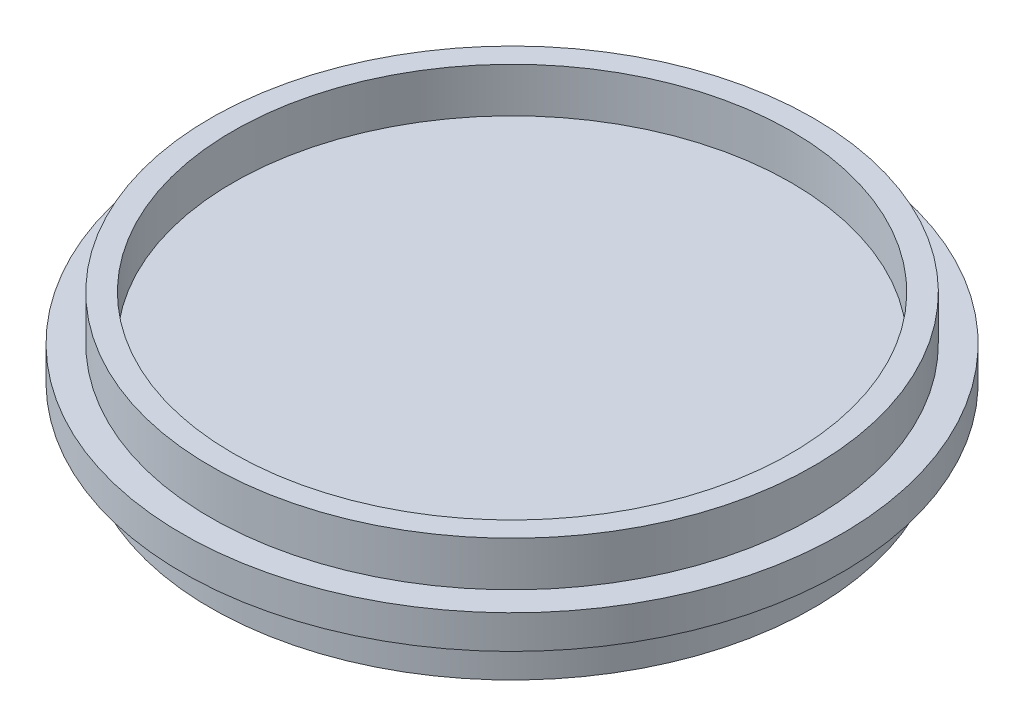
ISO-10303-21;
HEADER;
FILE_DESCRIPTION(('STEP AP214'),'2;1');
FILE_NAME('part.step','',(''),(''),'','','');
FILE_SCHEMA(('AUTOMOTIVE_DESIGN { 1 0 10303 214 1 1 1 1 }'));
ENDSEC;
DATA;
#1=APPLICATION_CONTEXT('core data for automotive mechanical design processes');
#2=APPLICATION_PROTOCOL_DEFINITION('international standard','automotive_design',2000,#1);
#3=PRODUCT_CONTEXT('',#1,'mechanical');
#4=PRODUCT('Part','Part','',(#3));
#5=PRODUCT_RELATED_PRODUCT_CATEGORY('part','',(#4));
#6=PRODUCT_DEFINITION_FORMATION('','',#4);
#7=PRODUCT_DEFINITION_CONTEXT('part definition',#1,'design');
#8=PRODUCT_DEFINITION('design','',#6,#7);
#9=PRODUCT_DEFINITION_SHAPE('','',#8);
#10=(LENGTH_UNIT() NAMED_UNIT(*) SI_UNIT(.MILLI.,.METRE.));
#11=(NAMED_UNIT(*) PLANE_ANGLE_UNIT() SI_UNIT($,.RADIAN.));
#12=(NAMED_UNIT(*) SI_UNIT($,.STERADIAN.) SOLID_ANGLE_UNIT());
#13=UNCERTAINTY_MEASURE_WITH_UNIT(LENGTH_MEASURE(1.E-05),#10,'distance_accuracy_value','');
#14=(GEOMETRIC_REPRESENTATION_CONTEXT(3) GLOBAL_UNCERTAINTY_ASSIGNED_CONTEXT((#13)) GLOBAL_UNIT_ASSIGNED_CONTEXT((#10,
#11,#12)) REPRESENTATION_CONTEXT('',''));
#15=CARTESIAN_POINT('',(0.,0.,0.));
#16=DIRECTION('',(0.,0.,1.));
#17=DIRECTION('',(1.,0.,0.));
#18=AXIS2_PLACEMENT_3D('',#15,#16,#17);
#19=CARTESIAN_POINT('',(63.8175,274.622160693961,-63.8175));
#20=DIRECTION('',(0.,-1.,0.));
#21=DIRECTION('',(0.,0.,-1.));
#22=AXIS2_PLACEMENT_3D('',#19,#20,#21);
#23=CYLINDRICAL_SURFACE('',#22,93.726);
#24=CARTESIAN_POINT('',(63.8175,9.52500000000001,-63.8175));
#25=DIRECTION('',(0.,-1.,0.));
#26=DIRECTION('',(0.,0.,-1.));
#27=AXIS2_PLACEMENT_3D('',#24,#25,#26);
#28=CIRCLE('',#27,93.726);
#29=CARTESIAN_POINT('',(63.8175,9.52500000000001,-157.5435));
#30=VERTEX_POINT('',#29);
#31=EDGE_CURVE('E52',#30,#30,#28,.F.);
#32=ORIENTED_EDGE('',*,*,#31,.F.);
#33=EDGE_LOOP('',(#32));
#34=FACE_BOUND('',#33,.T.);
#35=CARTESIAN_POINT('',(63.8175,0.,-63.8175));
#36=DIRECTION('',(0.,-1.,0.));
#37=DIRECTION('',(0.,0.,-1.));
#38=AXIS2_PLACEMENT_3D('',#35,#36,#37);
#39=CIRCLE('',#38,93.726);
#40=CARTESIAN_POINT('',(63.8175,0.,-157.5435));
#41=VERTEX_POINT('',#40);
#42=EDGE_CURVE('E57',#41,#41,#39,.T.);
#43=ORIENTED_EDGE('',*,*,#42,.F.);
#44=EDGE_LOOP('',(#43));
#45=FACE_BOUND('',#44,.T.);
#46=ADVANCED_FACE('F39',(#34,#45),#23,.T.);
#47=CARTESIAN_POINT('',(0.,9.525,0.));
#48=DIRECTION('',(0.,-1.,0.));
#49=DIRECTION('',(0.,0.,-1.));
#50=AXIS2_PLACEMENT_3D('',#47,#48,#49);
#51=PLANE('',#50);
#52=CARTESIAN_POINT('',(63.8175,9.525,-63.8175));
#53=DIRECTION('',(0.,-1.,0.));
#54=DIRECTION('',(0.,0.,-1.));
#55=AXIS2_PLACEMENT_3D('',#52,#53,#54);
#56=CIRCLE('',#55,85.725);
#57=CARTESIAN_POINT('',(63.8175,9.525,-149.5425));
#58=VERTEX_POINT('',#57);
#59=EDGE_CURVE('E76',#58,#58,#56,.T.);
#60=ORIENTED_EDGE('',*,*,#59,.T.);
#61=EDGE_LOOP('',(#60));
#62=FACE_BOUND('',#61,.T.);
#63=ORIENTED_EDGE('',*,*,#31,.T.);
#64=EDGE_LOOP('',(#63));
#65=FACE_BOUND('',#64,.T.);
#66=ADVANCED_FACE('F100',(#62,#65),#51,.F.);
#67=CARTESIAN_POINT('',(0.,0.,0.));
#68=DIRECTION('',(0.,-1.,0.));
#69=DIRECTION('',(0.,0.,-1.));
#70=AXIS2_PLACEMENT_3D('',#67,#68,#69);
#71=PLANE('',#70);
#72=CARTESIAN_POINT('',(63.8175,0.,-63.8175));
#73=DIRECTION('',(0.,-1.,0.));
#74=DIRECTION('',(0.,0.,-1.));
#75=AXIS2_PLACEMENT_3D('',#72,#73,#74);
#76=CIRCLE('',#75,85.725);
#77=CARTESIAN_POINT('',(63.8175,0.,-149.5425));
#78=VERTEX_POINT('',#77);
#79=EDGE_CURVE('E64',#78,#78,#76,.T.);
#80=ORIENTED_EDGE('',*,*,#79,.F.);
#81=EDGE_LOOP('',(#80));
#82=FACE_BOUND('',#81,.T.);
#83=ORIENTED_EDGE('',*,*,#42,.T.);
#84=EDGE_LOOP('',(#83));
#85=FACE_BOUND('',#84,.T.);
#86=ADVANCED_FACE('F41',(#82,#85),#71,.T.);
#87=CARTESIAN_POINT('',(63.8175,-12.7,-63.8175));
#88=DIRECTION('',(0.,-1.,0.));
#89=DIRECTION('',(0.,0.,-1.));
#90=AXIS2_PLACEMENT_3D('',#87,#88,#89);
#91=PLANE('',#90);
#92=CARTESIAN_POINT('',(63.8175,-12.7,-63.8175));
#93=DIRECTION('',(0.,-1.,0.));
#94=DIRECTION('',(0.,0.,-1.));
#95=AXIS2_PLACEMENT_3D('',#92,#93,#94);
#96=CIRCLE('',#95,85.725);
#97=CARTESIAN_POINT('',(63.8175,-12.7,-149.5425));
#98=VERTEX_POINT('',#97);
#99=EDGE_CURVE('E63',#98,#98,#96,.T.);
#100=ORIENTED_EDGE('',*,*,#99,.T.);
#101=EDGE_LOOP('',(#100));
#102=FACE_BOUND('',#101,.T.);
#103=CARTESIAN_POINT('',(63.8175,-12.7,-63.8175));
#104=DIRECTION('',(0.,-1.,0.));
#105=DIRECTION('',(0.,0.,-1.));
#106=AXIS2_PLACEMENT_3D('',#103,#104,#105);
#107=CIRCLE('',#106,79.375);
#108=CARTESIAN_POINT('',(63.8175,-12.7,-143.1925));
#109=VERTEX_POINT('',#108);
#110=EDGE_CURVE('E68',#109,#109,#107,.T.);
#111=ORIENTED_EDGE('',*,*,#110,.F.);
#112=EDGE_LOOP('',(#111));
#113=FACE_BOUND('',#112,.T.);
#114=ADVANCED_FACE('F117',(#102,#113),#91,.T.);
#115=CARTESIAN_POINT('',(63.8175,-12.7,-63.8175));
#116=DIRECTION('',(0.,1.,0.));
#117=DIRECTION('',(0.,0.,1.));
#118=AXIS2_PLACEMENT_3D('',#115,#116,#117);
#119=CYLINDRICAL_SURFACE('',#118,85.725);
#120=ORIENTED_EDGE('',*,*,#99,.F.);
#121=EDGE_LOOP('',(#120));
#122=FACE_BOUND('',#121,.T.);
#123=ORIENTED_EDGE('',*,*,#79,.T.);
#124=EDGE_LOOP('',(#123));
#125=FACE_BOUND('',#124,.T.);
#126=ADVANCED_FACE('F113',(#122,#125),#119,.T.);
#127=CARTESIAN_POINT('',(63.8175,-12.7,-63.8175));
#128=DIRECTION('',(0.,1.,0.));
#129=DIRECTION('',(0.,0.,1.));
#130=AXIS2_PLACEMENT_3D('',#127,#128,#129);
#131=CYLINDRICAL_SURFACE('',#130,79.375);
#132=ORIENTED_EDGE('',*,*,#110,.T.);
#133=EDGE_LOOP('',(#132));
#134=FACE_BOUND('',#133,.T.);
#135=CARTESIAN_POINT('',(63.8175,0.,-63.8175));
#136=DIRECTION('',(0.,-1.,0.));
#137=DIRECTION('',(0.,0.,-1.));
#138=AXIS2_PLACEMENT_3D('',#135,#136,#137);
#139=CIRCLE('',#138,79.375);
#140=CARTESIAN_POINT('',(63.8175,0.,-143.1925));
#141=VERTEX_POINT('',#140);
#142=EDGE_CURVE('E47',#141,#141,#139,.F.);
#143=ORIENTED_EDGE('',*,*,#142,.T.);
#144=EDGE_LOOP('',(#143));
#145=FACE_BOUND('',#144,.T.);
#146=ADVANCED_FACE('F116',(#134,#145),#131,.F.);
#147=ORIENTED_EDGE('',*,*,#142,.F.);
#148=EDGE_LOOP('',(#147));
#149=FACE_BOUND('',#148,.T.);
#150=ADVANCED_FACE('F124',(#149),#71,.T.);
#151=CARTESIAN_POINT('',(63.8175,22.225,-63.8175));
#152=DIRECTION('',(0.,-1.,0.));
#153=DIRECTION('',(0.,0.,-1.));
#154=AXIS2_PLACEMENT_3D('',#151,#152,#153);
#155=CYLINDRICAL_SURFACE('',#154,85.725);
#156=CARTESIAN_POINT('',(63.8175,22.225,-63.8175));
#157=DIRECTION('',(0.,-1.,0.));
#158=DIRECTION('',(0.,0.,-1.));
#159=AXIS2_PLACEMENT_3D('',#156,#157,#158);
#160=CIRCLE('',#159,85.725);
#161=CARTESIAN_POINT('',(63.8175,22.225,-149.5425));
#162=VERTEX_POINT('',#161);
#163=EDGE_CURVE('E75',#162,#162,#160,.T.);
#164=ORIENTED_EDGE('',*,*,#163,.T.);
#165=EDGE_LOOP('',(#164));
#166=FACE_BOUND('',#165,.T.);
#167=ORIENTED_EDGE('',*,*,#59,.F.);
#168=EDGE_LOOP('',(#167));
#169=FACE_BOUND('',#168,.T.);
#170=ADVANCED_FACE('F101',(#166,#169),#155,.T.);
#171=CARTESIAN_POINT('',(63.8175,22.225,-63.8175));
#172=DIRECTION('',(0.,1.,0.));
#173=DIRECTION('',(0.,0.,-1.));
#174=AXIS2_PLACEMENT_3D('',#171,#172,#173);
#175=PLANE('',#174);
#176=CARTESIAN_POINT('',(63.8175,22.225,-63.8175));
#177=DIRECTION('',(0.,-1.,0.));
#178=DIRECTION('',(0.,0.,-1.));
#179=AXIS2_PLACEMENT_3D('',#176,#177,#178);
#180=CIRCLE('',#179,79.375);
#181=CARTESIAN_POINT('',(63.8175,22.225,-143.1925));
#182=VERTEX_POINT('',#181);
#183=EDGE_CURVE('E80',#182,#182,#180,.T.);
#184=ORIENTED_EDGE('',*,*,#183,.T.);
#185=EDGE_LOOP('',(#184));
#186=FACE_BOUND('',#185,.T.);
#187=ORIENTED_EDGE('',*,*,#163,.F.);
#188=EDGE_LOOP('',(#187));
#189=FACE_BOUND('',#188,.T.);
#190=ADVANCED_FACE('F88',(#186,#189),#175,.T.);
#191=CARTESIAN_POINT('',(63.8175,22.225,-63.8175));
#192=DIRECTION('',(0.,-1.,0.));
#193=DIRECTION('',(0.,0.,-1.));
#194=AXIS2_PLACEMENT_3D('',#191,#192,#193);
#195=CYLINDRICAL_SURFACE('',#194,79.375);
#196=ORIENTED_EDGE('',*,*,#183,.F.);
#197=EDGE_LOOP('',(#196));
#198=FACE_BOUND('',#197,.T.);
#199=CARTESIAN_POINT('',(63.8175,9.525,-63.8175));
#200=DIRECTION('',(0.,-1.,0.));
#201=DIRECTION('',(0.,0.,-1.));
#202=AXIS2_PLACEMENT_3D('',#199,#200,#201);
#203=CIRCLE('',#202,79.375);
#204=CARTESIAN_POINT('',(63.8175,9.525,-143.1925));
#205=VERTEX_POINT('',#204);
#206=EDGE_CURVE('E10',#205,#205,#203,.T.);
#207=ORIENTED_EDGE('',*,*,#206,.T.);
#208=EDGE_LOOP('',(#207));
#209=FACE_BOUND('',#208,.T.);
#210=ADVANCED_FACE('F91',(#198,#209),#195,.F.);
#211=ORIENTED_EDGE('',*,*,#206,.F.);
#212=EDGE_LOOP('',(#211));
#213=FACE_BOUND('',#212,.T.);
#214=ADVANCED_FACE('F93',(#213),#51,.F.);
#215=CLOSED_SHELL('',(#46,#66,#86,#114,#126,#146,#150,#170,#190,#210,#214));
#216=MANIFOLD_SOLID_BREP('B2',#215);
#217=ADVANCED_BREP_SHAPE_REPRESENTATION('',(#18,#216),#14);
#218=SHAPE_DEFINITION_REPRESENTATION(#9,#217);
ENDSEC;
END-ISO-10303-21;
